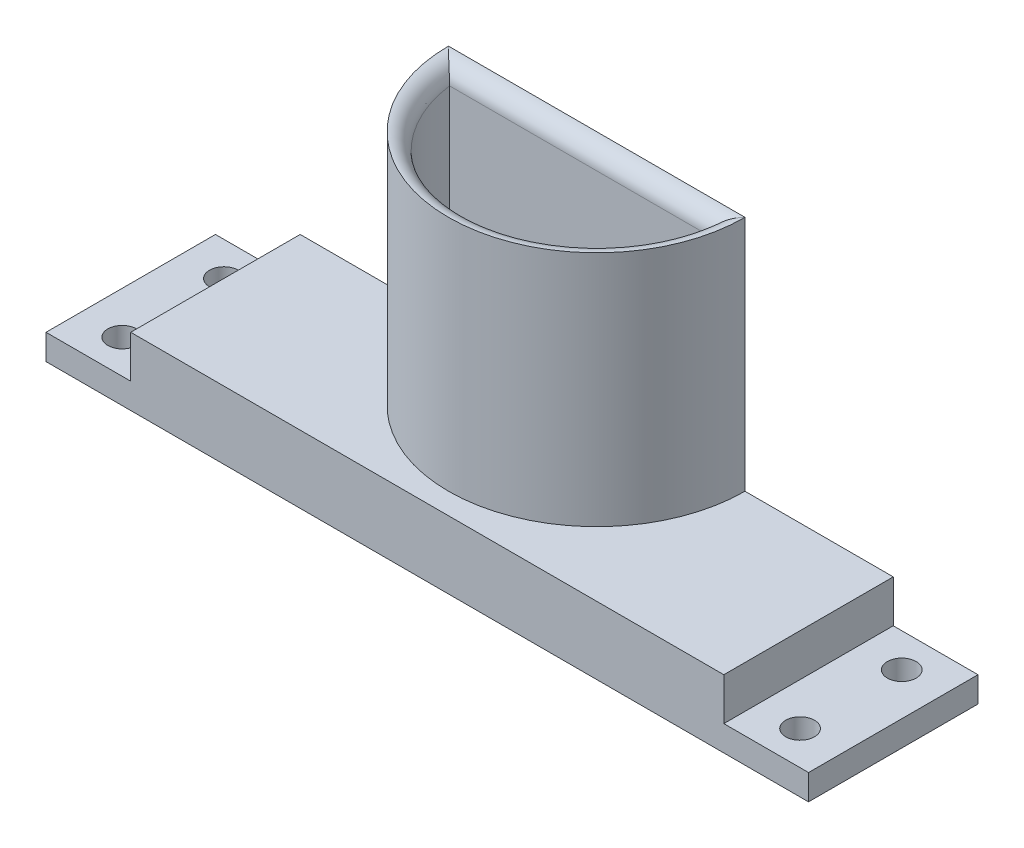
ISO-10303-21;
HEADER;
FILE_DESCRIPTION(('STEP AP214'),'2;1');
FILE_NAME('part.step','',(''),(''),'','','');
FILE_SCHEMA(('AUTOMOTIVE_DESIGN { 1 0 10303 214 1 1 1 1 }'));
ENDSEC;
DATA;
#1=APPLICATION_CONTEXT('core data for automotive mechanical design processes');
#2=APPLICATION_PROTOCOL_DEFINITION('international standard','automotive_design',2000,#1);
#3=PRODUCT_CONTEXT('',#1,'mechanical');
#4=PRODUCT('Part','Part','',(#3));
#5=PRODUCT_RELATED_PRODUCT_CATEGORY('part','',(#4));
#6=PRODUCT_DEFINITION_FORMATION('','',#4);
#7=PRODUCT_DEFINITION_CONTEXT('part definition',#1,'design');
#8=PRODUCT_DEFINITION('design','',#6,#7);
#9=PRODUCT_DEFINITION_SHAPE('','',#8);
#10=(LENGTH_UNIT() NAMED_UNIT(*) SI_UNIT(.MILLI.,.METRE.));
#11=(NAMED_UNIT(*) PLANE_ANGLE_UNIT() SI_UNIT($,.RADIAN.));
#12=(NAMED_UNIT(*) SI_UNIT($,.STERADIAN.) SOLID_ANGLE_UNIT());
#13=UNCERTAINTY_MEASURE_WITH_UNIT(LENGTH_MEASURE(1.E-05),#10,'distance_accuracy_value','');
#14=(GEOMETRIC_REPRESENTATION_CONTEXT(3) GLOBAL_UNCERTAINTY_ASSIGNED_CONTEXT((#13)) GLOBAL_UNIT_ASSIGNED_CONTEXT((#10,
#11,#12)) REPRESENTATION_CONTEXT('',''));
#15=CARTESIAN_POINT('',(0.,0.,0.));
#16=DIRECTION('',(0.,0.,1.));
#17=DIRECTION('',(1.,0.,0.));
#18=AXIS2_PLACEMENT_3D('',#15,#16,#17);
#19=CARTESIAN_POINT('',(35.,5.,10.));
#20=DIRECTION('',(-1.,0.,0.));
#21=DIRECTION('',(0.,0.,1.));
#22=AXIS2_PLACEMENT_3D('',#19,#20,#21);
#23=PLANE('',#22);
#24=DIRECTION('',(0.,0.,-1.));
#25=VECTOR('',#24,1.);
#26=CARTESIAN_POINT('',(35.,0.,10.));
#27=LINE('',#26,#25);
#28=CARTESIAN_POINT('',(35.,0.,10.));
#29=VERTEX_POINT('',#28);
#30=CARTESIAN_POINT('',(35.,0.,-10.));
#31=VERTEX_POINT('',#30);
#32=EDGE_CURVE('E217',#29,#31,#27,.T.);
#33=ORIENTED_EDGE('',*,*,#32,.T.);
#34=DIRECTION('',(0.,-1.,0.));
#35=VECTOR('',#34,1.);
#36=CARTESIAN_POINT('',(35.,5.,-10.));
#37=LINE('',#36,#35);
#38=CARTESIAN_POINT('',(35.,5.,-10.));
#39=VERTEX_POINT('',#38);
#40=EDGE_CURVE('E241',#39,#31,#37,.T.);
#41=ORIENTED_EDGE('',*,*,#40,.F.);
#42=DIRECTION('',(0.,0.,-1.));
#43=VECTOR('',#42,1.);
#44=CARTESIAN_POINT('',(35.,5.,10.));
#45=LINE('',#44,#43);
#46=CARTESIAN_POINT('',(35.,5.,10.));
#47=VERTEX_POINT('',#46);
#48=EDGE_CURVE('E218',#47,#39,#45,.T.);
#49=ORIENTED_EDGE('',*,*,#48,.F.);
#50=DIRECTION('',(0.,-1.,0.));
#51=VECTOR('',#50,1.);
#52=CARTESIAN_POINT('',(35.,5.,10.));
#53=LINE('',#52,#51);
#54=EDGE_CURVE('E228',#47,#29,#53,.T.);
#55=ORIENTED_EDGE('',*,*,#54,.T.);
#56=EDGE_LOOP('',(#33,#41,#49,#55));
#57=FACE_BOUND('',#56,.T.);
#58=ADVANCED_FACE('F43',(#57),#23,.F.);
#59=CARTESIAN_POINT('',(-35.,5.,-10.));
#60=DIRECTION('',(0.,0.,1.));
#61=DIRECTION('',(1.,0.,0.));
#62=AXIS2_PLACEMENT_3D('',#59,#60,#61);
#63=PLANE('',#62);
#64=ORIENTED_EDGE('',*,*,#40,.T.);
#65=DIRECTION('',(1.,0.,0.));
#66=VECTOR('',#65,1.);
#67=CARTESIAN_POINT('',(-45.,0.,-10.));
#68=LINE('',#67,#66);
#69=CARTESIAN_POINT('',(45.,0.,-10.));
#70=VERTEX_POINT('',#69);
#71=EDGE_CURVE('E203',#31,#70,#68,.T.);
#72=ORIENTED_EDGE('',*,*,#71,.T.);
#73=DIRECTION('',(0.,1.,0.));
#74=VECTOR('',#73,1.);
#75=CARTESIAN_POINT('',(45.,-3.,-10.));
#76=LINE('',#75,#74);
#77=CARTESIAN_POINT('',(45.,-3.,-10.));
#78=VERTEX_POINT('',#77);
#79=EDGE_CURVE('E195',#78,#70,#76,.T.);
#80=ORIENTED_EDGE('',*,*,#79,.F.);
#81=DIRECTION('',(1.,0.,0.));
#82=VECTOR('',#81,1.);
#83=CARTESIAN_POINT('',(-45.,-3.,-10.));
#84=LINE('',#83,#82);
#85=CARTESIAN_POINT('',(17.5,-3.,-10.));
#86=VERTEX_POINT('',#85);
#87=EDGE_CURVE('E192',#86,#78,#84,.T.);
#88=ORIENTED_EDGE('',*,*,#87,.F.);
#89=CARTESIAN_POINT('',(-17.5,-3.,-10.));
#90=VERTEX_POINT('',#89);
#91=EDGE_CURVE('E196',#90,#86,#84,.T.);
#92=ORIENTED_EDGE('',*,*,#91,.F.);
#93=CARTESIAN_POINT('',(-45.,-3.,-10.));
#94=VERTEX_POINT('',#93);
#95=EDGE_CURVE('E193',#94,#90,#84,.T.);
#96=ORIENTED_EDGE('',*,*,#95,.F.);
#97=DIRECTION('',(0.,1.,0.));
#98=VECTOR('',#97,1.);
#99=CARTESIAN_POINT('',(-45.,-3.,-10.));
#100=LINE('',#99,#98);
#101=CARTESIAN_POINT('',(-45.,0.,-10.));
#102=VERTEX_POINT('',#101);
#103=EDGE_CURVE('E208',#94,#102,#100,.T.);
#104=ORIENTED_EDGE('',*,*,#103,.T.);
#105=CARTESIAN_POINT('',(-35.,0.,-10.));
#106=VERTEX_POINT('',#105);
#107=EDGE_CURVE('E188',#102,#106,#68,.T.);
#108=ORIENTED_EDGE('',*,*,#107,.T.);
#109=DIRECTION('',(0.,-1.,0.));
#110=VECTOR('',#109,1.);
#111=CARTESIAN_POINT('',(-35.,5.,-10.));
#112=LINE('',#111,#110);
#113=CARTESIAN_POINT('',(-35.,5.,-10.));
#114=VERTEX_POINT('',#113);
#115=EDGE_CURVE('E238',#114,#106,#112,.T.);
#116=ORIENTED_EDGE('',*,*,#115,.F.);
#117=DIRECTION('',(-1.,0.,0.));
#118=VECTOR('',#117,1.);
#119=CARTESIAN_POINT('',(-35.,5.,-10.));
#120=LINE('',#119,#118);
#121=CARTESIAN_POINT('',(-17.5,5.,-10.));
#122=VERTEX_POINT('',#121);
#123=EDGE_CURVE('E175',#122,#114,#120,.T.);
#124=ORIENTED_EDGE('',*,*,#123,.F.);
#125=DIRECTION('',(0.,-1.,0.));
#126=VECTOR('',#125,1.);
#127=CARTESIAN_POINT('',(-17.5,33.,-10.));
#128=LINE('',#127,#126);
#129=CARTESIAN_POINT('',(-17.5,33.,-10.));
#130=VERTEX_POINT('',#129);
#131=EDGE_CURVE('E168',#130,#122,#128,.T.);
#132=ORIENTED_EDGE('',*,*,#131,.F.);
#133=DIRECTION('',(-1.,0.,0.));
#134=VECTOR('',#133,1.);
#135=CARTESIAN_POINT('',(0.,33.,-10.));
#136=LINE('',#135,#134);
#137=CARTESIAN_POINT('',(17.5,33.,-10.));
#138=VERTEX_POINT('',#137);
#139=EDGE_CURVE('E157',#138,#130,#136,.T.);
#140=ORIENTED_EDGE('',*,*,#139,.F.);
#141=DIRECTION('',(0.,-1.,0.));
#142=VECTOR('',#141,1.);
#143=CARTESIAN_POINT('',(17.5,33.,-10.));
#144=LINE('',#143,#142);
#145=CARTESIAN_POINT('',(17.5,5.,-10.));
#146=VERTEX_POINT('',#145);
#147=EDGE_CURVE('E169',#138,#146,#144,.T.);
#148=ORIENTED_EDGE('',*,*,#147,.T.);
#149=EDGE_CURVE('E222',#39,#146,#120,.T.);
#150=ORIENTED_EDGE('',*,*,#149,.F.);
#151=EDGE_LOOP('',(#64,#72,#80,#88,#92,#96,#104,#108,#116,#124,#132,#140,#148,#150));
#152=FACE_BOUND('',#151,.T.);
#153=ADVANCED_FACE('F173',(#152),#63,.F.);
#154=CARTESIAN_POINT('',(-35.,5.,10.));
#155=DIRECTION('',(1.,0.,0.));
#156=DIRECTION('',(0.,0.,-1.));
#157=AXIS2_PLACEMENT_3D('',#154,#155,#156);
#158=PLANE('',#157);
#159=DIRECTION('',(0.,0.,1.));
#160=VECTOR('',#159,1.);
#161=CARTESIAN_POINT('',(-35.,0.,10.));
#162=LINE('',#161,#160);
#163=CARTESIAN_POINT('',(-35.,0.,10.));
#164=VERTEX_POINT('',#163);
#165=EDGE_CURVE('E221',#106,#164,#162,.T.);
#166=ORIENTED_EDGE('',*,*,#165,.T.);
#167=DIRECTION('',(0.,-1.,0.));
#168=VECTOR('',#167,1.);
#169=CARTESIAN_POINT('',(-35.,5.,10.));
#170=LINE('',#169,#168);
#171=CARTESIAN_POINT('',(-35.,5.,10.));
#172=VERTEX_POINT('',#171);
#173=EDGE_CURVE('E235',#172,#164,#170,.T.);
#174=ORIENTED_EDGE('',*,*,#173,.F.);
#175=DIRECTION('',(0.,0.,1.));
#176=VECTOR('',#175,1.);
#177=CARTESIAN_POINT('',(-35.,5.,10.));
#178=LINE('',#177,#176);
#179=EDGE_CURVE('E224',#114,#172,#178,.T.);
#180=ORIENTED_EDGE('',*,*,#179,.F.);
#181=ORIENTED_EDGE('',*,*,#115,.T.);
#182=EDGE_LOOP('',(#166,#174,#180,#181));
#183=FACE_BOUND('',#182,.T.);
#184=ADVANCED_FACE('F345',(#183),#158,.F.);
#185=CARTESIAN_POINT('',(-35.,5.,10.));
#186=DIRECTION('',(0.,0.,-1.));
#187=DIRECTION('',(-1.,0.,0.));
#188=AXIS2_PLACEMENT_3D('',#185,#186,#187);
#189=PLANE('',#188);
#190=ORIENTED_EDGE('',*,*,#173,.T.);
#191=DIRECTION('',(-1.,0.,0.));
#192=VECTOR('',#191,1.);
#193=CARTESIAN_POINT('',(-45.,0.,10.));
#194=LINE('',#193,#192);
#195=CARTESIAN_POINT('',(-45.,0.,10.));
#196=VERTEX_POINT('',#195);
#197=EDGE_CURVE('E179',#164,#196,#194,.T.);
#198=ORIENTED_EDGE('',*,*,#197,.T.);
#199=DIRECTION('',(0.,1.,0.));
#200=VECTOR('',#199,1.);
#201=CARTESIAN_POINT('',(-45.,-3.,10.));
#202=LINE('',#201,#200);
#203=CARTESIAN_POINT('',(-45.,-3.,10.));
#204=VERTEX_POINT('',#203);
#205=EDGE_CURVE('E211',#204,#196,#202,.T.);
#206=ORIENTED_EDGE('',*,*,#205,.F.);
#207=DIRECTION('',(-1.,0.,0.));
#208=VECTOR('',#207,1.);
#209=CARTESIAN_POINT('',(-45.,-3.,10.));
#210=LINE('',#209,#208);
#211=CARTESIAN_POINT('',(45.,-3.,10.));
#212=VERTEX_POINT('',#211);
#213=EDGE_CURVE('E187',#212,#204,#210,.T.);
#214=ORIENTED_EDGE('',*,*,#213,.F.);
#215=DIRECTION('',(0.,1.,0.));
#216=VECTOR('',#215,1.);
#217=CARTESIAN_POINT('',(45.,-3.,10.));
#218=LINE('',#217,#216);
#219=CARTESIAN_POINT('',(45.,0.,10.));
#220=VERTEX_POINT('',#219);
#221=EDGE_CURVE('E214',#212,#220,#218,.T.);
#222=ORIENTED_EDGE('',*,*,#221,.T.);
#223=EDGE_CURVE('E198',#220,#29,#194,.T.);
#224=ORIENTED_EDGE('',*,*,#223,.T.);
#225=ORIENTED_EDGE('',*,*,#54,.F.);
#226=DIRECTION('',(1.,0.,0.));
#227=VECTOR('',#226,1.);
#228=CARTESIAN_POINT('',(-35.,5.,10.));
#229=LINE('',#228,#227);
#230=EDGE_CURVE('E226',#172,#47,#229,.T.);
#231=ORIENTED_EDGE('',*,*,#230,.F.);
#232=EDGE_LOOP('',(#190,#198,#206,#214,#222,#224,#225,#231));
#233=FACE_BOUND('',#232,.T.);
#234=ADVANCED_FACE('F319',(#233),#189,.F.);
#235=CARTESIAN_POINT('',(0.,5.,0.));
#236=DIRECTION('',(0.,-1.,0.));
#237=DIRECTION('',(0.,0.,-1.));
#238=AXIS2_PLACEMENT_3D('',#235,#236,#237);
#239=PLANE('',#238);
#240=CARTESIAN_POINT('',(0.,5.,-10.));
#241=DIRECTION('',(0.,1.,0.));
#242=DIRECTION('',(0.,0.,1.));
#243=AXIS2_PLACEMENT_3D('',#240,#241,#242);
#244=CIRCLE('',#243,17.5);
#245=EDGE_CURVE('E162',#122,#146,#244,.T.);
#246=ORIENTED_EDGE('',*,*,#245,.F.);
#247=ORIENTED_EDGE('',*,*,#123,.T.);
#248=ORIENTED_EDGE('',*,*,#179,.T.);
#249=ORIENTED_EDGE('',*,*,#230,.T.);
#250=ORIENTED_EDGE('',*,*,#48,.T.);
#251=ORIENTED_EDGE('',*,*,#149,.T.);
#252=EDGE_LOOP('',(#246,#247,#248,#249,#250,#251));
#253=FACE_BOUND('',#252,.T.);
#254=ADVANCED_FACE('F311',(#253),#239,.F.);
#255=CARTESIAN_POINT('',(0.,0.,0.));
#256=DIRECTION('',(0.,1.,0.));
#257=DIRECTION('',(0.,0.,1.));
#258=AXIS2_PLACEMENT_3D('',#255,#256,#257);
#259=PLANE('',#258);
#260=CARTESIAN_POINT('',(40.,0.,-6.));
#261=DIRECTION('',(0.,1.,0.));
#262=DIRECTION('',(0.,0.,1.));
#263=AXIS2_PLACEMENT_3D('',#260,#261,#262);
#264=CIRCLE('',#263,1.69999999999999);
#265=CARTESIAN_POINT('',(40.,0.,-4.3));
#266=VERTEX_POINT('',#265);
#267=EDGE_CURVE('E287',#266,#266,#264,.T.);
#268=ORIENTED_EDGE('',*,*,#267,.F.);
#269=EDGE_LOOP('',(#268));
#270=FACE_BOUND('',#269,.T.);
#271=CARTESIAN_POINT('',(40.,0.,6.));
#272=DIRECTION('',(0.,1.,0.));
#273=DIRECTION('',(0.,0.,1.));
#274=AXIS2_PLACEMENT_3D('',#271,#272,#273);
#275=CIRCLE('',#274,1.69999999999999);
#276=CARTESIAN_POINT('',(40.,0.,7.69999999999999));
#277=VERTEX_POINT('',#276);
#278=EDGE_CURVE('E284',#277,#277,#275,.T.);
#279=ORIENTED_EDGE('',*,*,#278,.F.);
#280=EDGE_LOOP('',(#279));
#281=FACE_BOUND('',#280,.T.);
#282=ORIENTED_EDGE('',*,*,#32,.F.);
#283=ORIENTED_EDGE('',*,*,#223,.F.);
#284=DIRECTION('',(0.,0.,1.));
#285=VECTOR('',#284,1.);
#286=CARTESIAN_POINT('',(45.,0.,-10.));
#287=LINE('',#286,#285);
#288=EDGE_CURVE('E176',#70,#220,#287,.T.);
#289=ORIENTED_EDGE('',*,*,#288,.F.);
#290=ORIENTED_EDGE('',*,*,#71,.F.);
#291=EDGE_LOOP('',(#282,#283,#289,#290));
#292=FACE_BOUND('',#291,.T.);
#293=ADVANCED_FACE('F316',(#270,#281,#292),#259,.T.);
#294=CARTESIAN_POINT('',(-40.,0.,-6.));
#295=DIRECTION('',(0.,1.,0.));
#296=DIRECTION('',(0.,0.,1.));
#297=AXIS2_PLACEMENT_3D('',#294,#295,#296);
#298=CIRCLE('',#297,1.69999999999999);
#299=CARTESIAN_POINT('',(-40.,0.,-4.30000000000001));
#300=VERTEX_POINT('',#299);
#301=EDGE_CURVE('E299',#300,#300,#298,.T.);
#302=ORIENTED_EDGE('',*,*,#301,.F.);
#303=EDGE_LOOP('',(#302));
#304=FACE_BOUND('',#303,.T.);
#305=CARTESIAN_POINT('',(-40.,0.,6.));
#306=DIRECTION('',(0.,1.,0.));
#307=DIRECTION('',(0.,0.,1.));
#308=AXIS2_PLACEMENT_3D('',#305,#306,#307);
#309=CIRCLE('',#308,1.69999999999999);
#310=CARTESIAN_POINT('',(-40.,0.,7.69999999999999));
#311=VERTEX_POINT('',#310);
#312=EDGE_CURVE('E288',#311,#311,#309,.T.);
#313=ORIENTED_EDGE('',*,*,#312,.F.);
#314=EDGE_LOOP('',(#313));
#315=FACE_BOUND('',#314,.T.);
#316=ORIENTED_EDGE('',*,*,#165,.F.);
#317=ORIENTED_EDGE('',*,*,#107,.F.);
#318=DIRECTION('',(0.,0.,-1.));
#319=VECTOR('',#318,1.);
#320=CARTESIAN_POINT('',(-45.,0.,-10.));
#321=LINE('',#320,#319);
#322=EDGE_CURVE('E201',#196,#102,#321,.T.);
#323=ORIENTED_EDGE('',*,*,#322,.F.);
#324=ORIENTED_EDGE('',*,*,#197,.F.);
#325=EDGE_LOOP('',(#316,#317,#323,#324));
#326=FACE_BOUND('',#325,.T.);
#327=ADVANCED_FACE('F342',(#304,#315,#326),#259,.T.);
#328=CARTESIAN_POINT('',(45.,-3.,-10.));
#329=DIRECTION('',(-1.,0.,0.));
#330=DIRECTION('',(0.,0.,1.));
#331=AXIS2_PLACEMENT_3D('',#328,#329,#330);
#332=PLANE('',#331);
#333=ORIENTED_EDGE('',*,*,#288,.T.);
#334=ORIENTED_EDGE('',*,*,#221,.F.);
#335=DIRECTION('',(0.,0.,1.));
#336=VECTOR('',#335,1.);
#337=CARTESIAN_POINT('',(45.,-3.,-10.));
#338=LINE('',#337,#336);
#339=EDGE_CURVE('E184',#78,#212,#338,.T.);
#340=ORIENTED_EDGE('',*,*,#339,.F.);
#341=ORIENTED_EDGE('',*,*,#79,.T.);
#342=EDGE_LOOP('',(#333,#334,#340,#341));
#343=FACE_BOUND('',#342,.T.);
#344=ADVANCED_FACE('F324',(#343),#332,.F.);
#345=CARTESIAN_POINT('',(-45.,-3.,-10.));
#346=DIRECTION('',(1.,0.,0.));
#347=DIRECTION('',(0.,0.,-1.));
#348=AXIS2_PLACEMENT_3D('',#345,#346,#347);
#349=PLANE('',#348);
#350=ORIENTED_EDGE('',*,*,#322,.T.);
#351=ORIENTED_EDGE('',*,*,#103,.F.);
#352=DIRECTION('',(0.,0.,-1.));
#353=VECTOR('',#352,1.);
#354=CARTESIAN_POINT('',(-45.,-3.,-10.));
#355=LINE('',#354,#353);
#356=EDGE_CURVE('E190',#204,#94,#355,.T.);
#357=ORIENTED_EDGE('',*,*,#356,.F.);
#358=ORIENTED_EDGE('',*,*,#205,.T.);
#359=EDGE_LOOP('',(#350,#351,#357,#358));
#360=FACE_BOUND('',#359,.T.);
#361=ADVANCED_FACE('F347',(#360),#349,.F.);
#362=CARTESIAN_POINT('',(0.,-3.,0.));
#363=DIRECTION('',(0.,1.,0.));
#364=DIRECTION('',(0.,0.,1.));
#365=AXIS2_PLACEMENT_3D('',#362,#363,#364);
#366=PLANE('',#365);
#367=CARTESIAN_POINT('',(-40.,-3.,-6.));
#368=DIRECTION('',(0.,1.,0.));
#369=DIRECTION('',(0.,0.,1.));
#370=AXIS2_PLACEMENT_3D('',#367,#368,#369);
#371=CIRCLE('',#370,1.69999999999999);
#372=CARTESIAN_POINT('',(-40.,-3.,-4.30000000000001));
#373=VERTEX_POINT('',#372);
#374=EDGE_CURVE('E48',#373,#373,#371,.T.);
#375=ORIENTED_EDGE('',*,*,#374,.T.);
#376=EDGE_LOOP('',(#375));
#377=FACE_BOUND('',#376,.T.);
#378=CARTESIAN_POINT('',(-40.,-3.,6.));
#379=DIRECTION('',(0.,1.,0.));
#380=DIRECTION('',(0.,0.,1.));
#381=AXIS2_PLACEMENT_3D('',#378,#379,#380);
#382=CIRCLE('',#381,1.69999999999999);
#383=CARTESIAN_POINT('',(-40.,-3.,7.69999999999999));
#384=VERTEX_POINT('',#383);
#385=EDGE_CURVE('E285',#384,#384,#382,.T.);
#386=ORIENTED_EDGE('',*,*,#385,.T.);
#387=EDGE_LOOP('',(#386));
#388=FACE_BOUND('',#387,.T.);
#389=CARTESIAN_POINT('',(40.,-3.,-6.));
#390=DIRECTION('',(0.,1.,0.));
#391=DIRECTION('',(0.,0.,1.));
#392=AXIS2_PLACEMENT_3D('',#389,#390,#391);
#393=CIRCLE('',#392,1.69999999999999);
#394=CARTESIAN_POINT('',(40.,-3.,-4.30000000000001));
#395=VERTEX_POINT('',#394);
#396=EDGE_CURVE('E292',#395,#395,#393,.T.);
#397=ORIENTED_EDGE('',*,*,#396,.T.);
#398=EDGE_LOOP('',(#397));
#399=FACE_BOUND('',#398,.T.);
#400=CARTESIAN_POINT('',(40.,-3.,6.));
#401=DIRECTION('',(0.,1.,0.));
#402=DIRECTION('',(0.,0.,1.));
#403=AXIS2_PLACEMENT_3D('',#400,#401,#402);
#404=CIRCLE('',#403,1.69999999999999);
#405=CARTESIAN_POINT('',(40.,-3.,7.69999999999999));
#406=VERTEX_POINT('',#405);
#407=EDGE_CURVE('E282',#406,#406,#404,.T.);
#408=ORIENTED_EDGE('',*,*,#407,.T.);
#409=EDGE_LOOP('',(#408));
#410=FACE_BOUND('',#409,.T.);
#411=ORIENTED_EDGE('',*,*,#95,.T.);
#412=CARTESIAN_POINT('',(0.,-3.,-10.));
#413=DIRECTION('',(0.,1.,0.));
#414=DIRECTION('',(0.,0.,1.));
#415=AXIS2_PLACEMENT_3D('',#412,#413,#414);
#416=CIRCLE('',#415,17.5);
#417=EDGE_CURVE('E247',#90,#86,#416,.T.);
#418=ORIENTED_EDGE('',*,*,#417,.T.);
#419=ORIENTED_EDGE('',*,*,#87,.T.);
#420=ORIENTED_EDGE('',*,*,#339,.T.);
#421=ORIENTED_EDGE('',*,*,#213,.T.);
#422=ORIENTED_EDGE('',*,*,#356,.T.);
#423=EDGE_LOOP('',(#411,#418,#419,#420,#421,#422));
#424=FACE_BOUND('',#423,.T.);
#425=ADVANCED_FACE('F335',(#377,#388,#399,#410,#424),#366,.F.);
#426=CARTESIAN_POINT('',(0.,33.,-10.));
#427=DIRECTION('',(0.,-1.,0.));
#428=DIRECTION('',(0.,0.,-1.));
#429=AXIS2_PLACEMENT_3D('',#426,#427,#428);
#430=CYLINDRICAL_SURFACE('',#429,17.5);
#431=ORIENTED_EDGE('',*,*,#245,.T.);
#432=ORIENTED_EDGE('',*,*,#147,.F.);
#433=CARTESIAN_POINT('',(0.,33.,-10.));
#434=DIRECTION('',(0.,1.,0.));
#435=DIRECTION('',(0.,0.,1.));
#436=AXIS2_PLACEMENT_3D('',#433,#434,#435);
#437=CIRCLE('',#436,17.5);
#438=EDGE_CURVE('E147',#130,#138,#437,.T.);
#439=ORIENTED_EDGE('',*,*,#438,.F.);
#440=ORIENTED_EDGE('',*,*,#131,.T.);
#441=EDGE_LOOP('',(#431,#432,#439,#440));
#442=FACE_BOUND('',#441,.T.);
#443=ADVANCED_FACE('F167',(#442),#430,.T.);
#444=CARTESIAN_POINT('',(0.,-3.,-10.));
#445=DIRECTION('',(0.,1.,0.));
#446=DIRECTION('',(0.,0.,1.));
#447=AXIS2_PLACEMENT_3D('',#444,#445,#446);
#448=CYLINDRICAL_SURFACE('',#447,15.5);
#449=DIRECTION('',(0.,1.,0.));
#450=VECTOR('',#449,1.);
#451=CARTESIAN_POINT('',(15.3704261489394,-3.,-8.));
#452=LINE('',#451,#450);
#453=CARTESIAN_POINT('',(15.3704261489394,-1.,-8.));
#454=VERTEX_POINT('',#453);
#455=CARTESIAN_POINT('',(15.3704261489394,31.,-8.));
#456=VERTEX_POINT('',#455);
#457=EDGE_CURVE('E153',#454,#456,#452,.T.);
#458=ORIENTED_EDGE('',*,*,#457,.F.);
#459=CARTESIAN_POINT('',(0.,-1.,-10.));
#460=DIRECTION('',(0.,1.,0.));
#461=DIRECTION('',(0.,0.,1.));
#462=AXIS2_PLACEMENT_3D('',#459,#460,#461);
#463=CIRCLE('',#462,15.5);
#464=CARTESIAN_POINT('',(-15.3704261489394,-1.,-8.));
#465=VERTEX_POINT('',#464);
#466=EDGE_CURVE('E11',#454,#465,#463,.F.);
#467=ORIENTED_EDGE('',*,*,#466,.T.);
#468=DIRECTION('',(0.,1.,0.));
#469=VECTOR('',#468,1.);
#470=CARTESIAN_POINT('',(-15.3704261489394,-3.,-8.));
#471=LINE('',#470,#469);
#472=CARTESIAN_POINT('',(-15.3704261489394,31.,-8.));
#473=VERTEX_POINT('',#472);
#474=EDGE_CURVE('E306',#465,#473,#471,.T.);
#475=ORIENTED_EDGE('',*,*,#474,.T.);
#476=CARTESIAN_POINT('',(0.,31.,-10.));
#477=DIRECTION('',(0.,1.,0.));
#478=DIRECTION('',(0.,0.,1.));
#479=AXIS2_PLACEMENT_3D('',#476,#477,#478);
#480=CIRCLE('',#479,15.5);
#481=EDGE_CURVE('E150',#473,#456,#480,.T.);
#482=ORIENTED_EDGE('',*,*,#481,.T.);
#483=EDGE_LOOP('',(#458,#467,#475,#482));
#484=FACE_BOUND('',#483,.T.);
#485=ADVANCED_FACE('F382',(#484),#448,.F.);
#486=CARTESIAN_POINT('',(15.3704261489394,-3.,-8.));
#487=DIRECTION('',(0.,0.,-1.));
#488=DIRECTION('',(-1.,0.,0.));
#489=AXIS2_PLACEMENT_3D('',#486,#487,#488);
#490=PLANE('',#489);
#491=ORIENTED_EDGE('',*,*,#474,.F.);
#492=DIRECTION('',(-1.,0.,0.));
#493=VECTOR('',#492,1.);
#494=CARTESIAN_POINT('',(15.3704261489394,-1.,-8.));
#495=LINE('',#494,#493);
#496=EDGE_CURVE('E53',#465,#454,#495,.F.);
#497=ORIENTED_EDGE('',*,*,#496,.T.);
#498=ORIENTED_EDGE('',*,*,#457,.T.);
#499=DIRECTION('',(-1.,0.,0.));
#500=VECTOR('',#499,1.);
#501=CARTESIAN_POINT('',(-15.3704261489394,31.,-8.));
#502=LINE('',#501,#500);
#503=EDGE_CURVE('E244',#456,#473,#502,.T.);
#504=ORIENTED_EDGE('',*,*,#503,.T.);
#505=EDGE_LOOP('',(#491,#497,#498,#504));
#506=FACE_BOUND('',#505,.T.);
#507=ADVANCED_FACE('F263',(#506),#490,.F.);
#508=CARTESIAN_POINT('',(15.3704261489394,31.,-10.));
#509=DIRECTION('',(1.,0.,0.));
#510=DIRECTION('',(0.,0.,-1.));
#511=AXIS2_PLACEMENT_3D('',#508,#509,#510);
#512=CYLINDRICAL_SURFACE('',#511,2.);
#513=CARTESIAN_POINT('',(15.3704261489394,31.,-8.));
#514=CARTESIAN_POINT('',(15.3704113490324,31.0434603124713,-7.99998789623637));
#515=CARTESIAN_POINT('',(15.3720384867977,31.0869097163397,-8.00141614860178));
#516=CARTESIAN_POINT('',(15.3784623074006,31.1733474667974,-8.00705955264037));
#517=CARTESIAN_POINT('',(15.3832557060606,31.2163362442655,-8.01127181662339));
#518=CARTESIAN_POINT('',(15.3958332317555,31.3010678103459,-8.0223326945883));
#519=CARTESIAN_POINT('',(15.4035861385886,31.3428188610949,-8.02915378911016));
#520=CARTESIAN_POINT('',(15.4218873065089,31.4252097834838,-8.04527211246546));
#521=CARTESIAN_POINT('',(15.4324361262038,31.4658494312796,-8.05456983611728));
#522=CARTESIAN_POINT('',(15.4678452451839,31.5853710437738,-8.08581947718849));
#523=CARTESIAN_POINT('',(15.496533325425,31.6622711603222,-8.11118487201765));
#524=CARTESIAN_POINT('',(15.5621676042231,31.8095168129804,-8.16942803416061));
#525=CARTESIAN_POINT('',(15.5991370150493,31.8798431219544,-8.20232692346899));
#526=CARTESIAN_POINT('',(15.6990783145784,32.0460657957153,-8.29164333111114));
#527=CARTESIAN_POINT('',(15.7659303858716,32.137671288152,-8.35169901986379));
#528=CARTESIAN_POINT('',(15.9090438640022,32.3055985847829,-8.48121517508006));
#529=CARTESIAN_POINT('',(15.9853250889464,32.3818872824975,-8.55069548098992));
#530=CARTESIAN_POINT('',(16.1218211511116,32.5007425086086,-8.67599534594904));
#531=CARTESIAN_POINT('',(16.1805623666144,32.5467729873894,-8.7302004625344));
#532=CARTESIAN_POINT('',(16.3004423371165,32.6317687906735,-8.84145191677523));
#533=CARTESIAN_POINT('',(16.3615821779766,32.6707308693488,-8.89849954447002));
#534=CARTESIAN_POINT('',(16.5476428293294,32.7775070718227,-9.07311939366307));
#535=CARTESIAN_POINT('',(16.6752124326251,32.8352175913138,-9.19417559964872));
#536=CARTESIAN_POINT('',(16.9181145433245,32.9198098930191,-9.42741593743311));
#537=CARTESIAN_POINT('',(17.0331179892186,32.9495227784052,-9.53896495980482));
#538=CARTESIAN_POINT('',(17.2635313505971,32.9894097494525,-9.76475155047689));
#539=CARTESIAN_POINT('',(17.3789397753517,32.9996275202113,-9.87898252567176));
#540=CARTESIAN_POINT('',(17.495783478261,32.9999966634796,-9.99578385666528));
#541=CARTESIAN_POINT('',(17.4978918559567,32.9999999965333,-9.99789185333453));
#542=CARTESIAN_POINT('',(17.5,33.,-10.));
#543=B_SPLINE_CURVE_WITH_KNOTS('',3,(#513,#514,#515,#516,#517,#518,#519,#520,#521,#522,#523,
#524,#525,#526,#527,#528,#529,#530,#531,#532,#533,#534,#535,#536,#537,#538,#539,#540,#541,#542),
.UNSPECIFIED.,.F.,.F.,(4,2,2,2,2,2,2,2,2,2,2,2,2,2,4),(0.,0.130309398659017,0.260483846779937,
0.389321409732268,0.518184733132639,0.774655769336656,1.03185488546772,1.41469409605983,
1.7983520909447,2.07470453961497,2.35118357061114,2.90410540558524,3.39188285813809,
3.87856599820887,3.88751027574357),.UNSPECIFIED.);
#544=EDGE_CURVE('E154',#138,#456,#543,.F.);
#545=ORIENTED_EDGE('',*,*,#544,.F.);
#546=ORIENTED_EDGE('',*,*,#139,.T.);
#547=CARTESIAN_POINT('',(-15.3704261489394,31.,-8.));
#548=CARTESIAN_POINT('',(-15.3704113490324,31.0434603124713,-7.99998789623637));
#549=CARTESIAN_POINT('',(-15.3720384867977,31.0869097163397,-8.00141614860178));
#550=CARTESIAN_POINT('',(-15.3784623074006,31.1733474667974,-8.00705955264037));
#551=CARTESIAN_POINT('',(-15.3832557060606,31.2163362442655,-8.01127181662339));
#552=CARTESIAN_POINT('',(-15.3958332317555,31.3010678103459,-8.0223326945883));
#553=CARTESIAN_POINT('',(-15.4035861385886,31.3428188610949,-8.02915378911016));
#554=CARTESIAN_POINT('',(-15.4218873065089,31.4252097834838,-8.04527211246546));
#555=CARTESIAN_POINT('',(-15.4324361262038,31.4658494312796,-8.05456983611728));
#556=CARTESIAN_POINT('',(-15.4678452451839,31.5853710437738,-8.08581947718849));
#557=CARTESIAN_POINT('',(-15.496533325425,31.6622711603222,-8.11118487201765));
#558=CARTESIAN_POINT('',(-15.5621676042231,31.8095168129804,-8.16942803416061));
#559=CARTESIAN_POINT('',(-15.5991370150493,31.8798431219544,-8.20232692346899));
#560=CARTESIAN_POINT('',(-15.6990783145784,32.0460657957153,-8.29164333111114));
#561=CARTESIAN_POINT('',(-15.7659303858716,32.137671288152,-8.35169901986379));
#562=CARTESIAN_POINT('',(-15.9090438640022,32.3055985847829,-8.48121517508006));
#563=CARTESIAN_POINT('',(-15.9853250889464,32.3818872824975,-8.55069548098992));
#564=CARTESIAN_POINT('',(-16.1218211511116,32.5007425086086,-8.67599534594904));
#565=CARTESIAN_POINT('',(-16.1805623666144,32.5467729873894,-8.7302004625344));
#566=CARTESIAN_POINT('',(-16.3004423371165,32.6317687906735,-8.84145191677523));
#567=CARTESIAN_POINT('',(-16.3615821779766,32.6707308693488,-8.89849954447002));
#568=CARTESIAN_POINT('',(-16.5476428293294,32.7775070718227,-9.07311939366307));
#569=CARTESIAN_POINT('',(-16.6752124326251,32.8352175913138,-9.19417559964872));
#570=CARTESIAN_POINT('',(-16.9181145433245,32.9198098930191,-9.42741593743311));
#571=CARTESIAN_POINT('',(-17.0331179892186,32.9495227784052,-9.53896495980482));
#572=CARTESIAN_POINT('',(-17.2635313505971,32.9894097494525,-9.76475155047689));
#573=CARTESIAN_POINT('',(-17.3789397753517,32.9996275202113,-9.87898252567176));
#574=CARTESIAN_POINT('',(-17.495783478261,32.9999966634796,-9.99578385666528));
#575=CARTESIAN_POINT('',(-17.4978918559567,32.9999999965333,-9.99789185333453));
#576=CARTESIAN_POINT('',(-17.5,33.,-10.));
#577=B_SPLINE_CURVE_WITH_KNOTS('',3,(#547,#548,#549,#550,#551,#552,#553,#554,#555,#556,#557,
#558,#559,#560,#561,#562,#563,#564,#565,#566,#567,#568,#569,#570,#571,#572,#573,#574,#575,#576),
.UNSPECIFIED.,.F.,.F.,(4,2,2,2,2,2,2,2,2,2,2,2,2,2,4),(0.,0.130309398659017,0.260483846779937,
0.389321409732268,0.518184733132639,0.774655769336656,1.03185488546772,1.41469409605983,
1.7983520909447,2.07470453961497,2.35118357061114,2.90410540558524,3.39188285813809,
3.87856599820887,3.88751027574357),.UNSPECIFIED.);
#578=EDGE_CURVE('E142',#473,#130,#577,.T.);
#579=ORIENTED_EDGE('',*,*,#578,.F.);
#580=ORIENTED_EDGE('',*,*,#503,.F.);
#581=EDGE_LOOP('',(#545,#546,#579,#580));
#582=FACE_BOUND('',#581,.T.);
#583=ADVANCED_FACE('F158',(#582),#512,.T.);
#584=CARTESIAN_POINT('',(0.,31.,-10.));
#585=DIRECTION('',(0.,1.,0.));
#586=DIRECTION('',(0.,0.,1.));
#587=AXIS2_PLACEMENT_3D('',#584,#585,#586);
#588=TOROIDAL_SURFACE('',#587,17.5,2.);
#589=ORIENTED_EDGE('',*,*,#578,.T.);
#590=ORIENTED_EDGE('',*,*,#438,.T.);
#591=ORIENTED_EDGE('',*,*,#544,.T.);
#592=ORIENTED_EDGE('',*,*,#481,.F.);
#593=EDGE_LOOP('',(#589,#590,#591,#592));
#594=FACE_BOUND('',#593,.T.);
#595=ADVANCED_FACE('F144',(#594),#588,.T.);
#596=CARTESIAN_POINT('',(0.,-1.,-10.));
#597=DIRECTION('',(0.,1.,0.));
#598=DIRECTION('',(0.,0.,1.));
#599=AXIS2_PLACEMENT_3D('',#596,#597,#598);
#600=TOROIDAL_SURFACE('',#599,17.5,2.);
#601=CARTESIAN_POINT('',(-15.3704261489394,-1.,-8.));
#602=CARTESIAN_POINT('',(-15.3704113490324,-1.04346031247127,-7.99998789623637));
#603=CARTESIAN_POINT('',(-15.3720384867977,-1.0869097163397,-8.00141614860178));
#604=CARTESIAN_POINT('',(-15.3784623074006,-1.17334746679736,-8.00705955264037));
#605=CARTESIAN_POINT('',(-15.3832557060606,-1.21633624426547,-8.01127181662339));
#606=CARTESIAN_POINT('',(-15.3958332317555,-1.30106781034593,-8.0223326945883));
#607=CARTESIAN_POINT('',(-15.4035861385886,-1.34281886109492,-8.02915378911016));
#608=CARTESIAN_POINT('',(-15.4218873065089,-1.42520978348377,-8.04527211246546));
#609=CARTESIAN_POINT('',(-15.4324361262038,-1.46584943127963,-8.05456983611728));
#610=CARTESIAN_POINT('',(-15.4678452451839,-1.58537104377379,-8.08581947718849));
#611=CARTESIAN_POINT('',(-15.496533325425,-1.66227116032219,-8.11118487201765));
#612=CARTESIAN_POINT('',(-15.5621676042231,-1.80951681298037,-8.16942803416061));
#613=CARTESIAN_POINT('',(-15.5991370150493,-1.87984312195444,-8.20232692346899));
#614=CARTESIAN_POINT('',(-15.6990783145784,-2.04606579571527,-8.29164333111114));
#615=CARTESIAN_POINT('',(-15.7659303858716,-2.13767128815196,-8.35169901986379));
#616=CARTESIAN_POINT('',(-15.9090438640022,-2.30559858478294,-8.48121517508007));
#617=CARTESIAN_POINT('',(-15.9853250889464,-2.38188728249755,-8.55069548098992));
#618=CARTESIAN_POINT('',(-16.1218211511116,-2.50074250860862,-8.67599534594904));
#619=CARTESIAN_POINT('',(-16.1805623666144,-2.54677298738937,-8.73020046253439));
#620=CARTESIAN_POINT('',(-16.3004423371165,-2.63176879067351,-8.84145191677522));
#621=CARTESIAN_POINT('',(-16.3615821779766,-2.67073086934884,-8.89849954447002));
#622=CARTESIAN_POINT('',(-16.5476428293294,-2.77750707182268,-9.07311939366307));
#623=CARTESIAN_POINT('',(-16.6752124326252,-2.83521759131378,-9.19417559964869));
#624=CARTESIAN_POINT('',(-16.9181145433245,-2.9198098930191,-9.42741593743313));
#625=CARTESIAN_POINT('',(-17.0331179892185,-2.94952277840521,-9.5389649598049));
#626=CARTESIAN_POINT('',(-17.2635313505972,-2.98940974945247,-9.76475155047682));
#627=CARTESIAN_POINT('',(-17.378939775352,-2.99962752021137,-9.87898252567148));
#628=CARTESIAN_POINT('',(-17.495783478261,-2.99999666347959,-9.99578385666527));
#629=CARTESIAN_POINT('',(-17.4978918559567,-2.99999999653327,-9.99789185333453));
#630=CARTESIAN_POINT('',(-17.5,-3.,-10.));
#631=B_SPLINE_CURVE_WITH_KNOTS('',3,(#601,#602,#603,#604,#605,#606,#607,#608,#609,#610,#611,
#612,#613,#614,#615,#616,#617,#618,#619,#620,#621,#622,#623,#624,#625,#626,#627,#628,#629,#630),
.UNSPECIFIED.,.F.,.F.,(4,2,2,2,2,2,2,2,2,2,2,2,2,2,4),(0.,0.130309398659014,0.260483846779928,
0.389321409732269,0.518184733132643,0.77465576933666,1.03185488546773,1.41469409605983,
1.7983520909447,2.07470453961497,2.35118357061113,2.90410540558525,3.39188285813811,
3.87856599820888,3.88751027574357),.UNSPECIFIED.);
#632=EDGE_CURVE('E271',#465,#90,#631,.T.);
#633=ORIENTED_EDGE('',*,*,#632,.F.);
#634=ORIENTED_EDGE('',*,*,#466,.F.);
#635=CARTESIAN_POINT('',(15.3704261489394,-1.,-8.));
#636=CARTESIAN_POINT('',(15.3704113490324,-1.04346031247127,-7.99998789623637));
#637=CARTESIAN_POINT('',(15.3720384867977,-1.0869097163397,-8.00141614860178));
#638=CARTESIAN_POINT('',(15.3784623074006,-1.17334746679736,-8.00705955264037));
#639=CARTESIAN_POINT('',(15.3832557060606,-1.21633624426547,-8.01127181662339));
#640=CARTESIAN_POINT('',(15.3958332317555,-1.30106781034593,-8.0223326945883));
#641=CARTESIAN_POINT('',(15.4035861385886,-1.34281886109492,-8.02915378911016));
#642=CARTESIAN_POINT('',(15.4218873065089,-1.42520978348377,-8.04527211246546));
#643=CARTESIAN_POINT('',(15.4324361262038,-1.46584943127963,-8.05456983611728));
#644=CARTESIAN_POINT('',(15.4678452451839,-1.58537104377379,-8.08581947718849));
#645=CARTESIAN_POINT('',(15.496533325425,-1.66227116032219,-8.11118487201765));
#646=CARTESIAN_POINT('',(15.5621676042231,-1.80951681298037,-8.16942803416061));
#647=CARTESIAN_POINT('',(15.5991370150493,-1.87984312195444,-8.20232692346899));
#648=CARTESIAN_POINT('',(15.6990783145784,-2.04606579571527,-8.29164333111114));
#649=CARTESIAN_POINT('',(15.7659303858716,-2.13767128815196,-8.35169901986379));
#650=CARTESIAN_POINT('',(15.9090438640022,-2.30559858478294,-8.48121517508007));
#651=CARTESIAN_POINT('',(15.9853250889464,-2.38188728249755,-8.55069548098992));
#652=CARTESIAN_POINT('',(16.1218211511116,-2.50074250860862,-8.67599534594904));
#653=CARTESIAN_POINT('',(16.1805623666144,-2.54677298738937,-8.73020046253439));
#654=CARTESIAN_POINT('',(16.3004423371165,-2.63176879067351,-8.84145191677522));
#655=CARTESIAN_POINT('',(16.3615821779766,-2.67073086934884,-8.89849954447002));
#656=CARTESIAN_POINT('',(16.5476428293294,-2.77750707182268,-9.07311939366307));
#657=CARTESIAN_POINT('',(16.6752124326252,-2.83521759131378,-9.19417559964869));
#658=CARTESIAN_POINT('',(16.9181145433245,-2.9198098930191,-9.42741593743313));
#659=CARTESIAN_POINT('',(17.0331179892185,-2.94952277840521,-9.5389649598049));
#660=CARTESIAN_POINT('',(17.2635313505972,-2.98940974945247,-9.76475155047682));
#661=CARTESIAN_POINT('',(17.378939775352,-2.99962752021137,-9.87898252567148));
#662=CARTESIAN_POINT('',(17.495783478261,-2.99999666347959,-9.99578385666527));
#663=CARTESIAN_POINT('',(17.4978918559567,-2.99999999653327,-9.99789185333453));
#664=CARTESIAN_POINT('',(17.5,-3.,-10.));
#665=B_SPLINE_CURVE_WITH_KNOTS('',3,(#635,#636,#637,#638,#639,#640,#641,#642,#643,#644,#645,
#646,#647,#648,#649,#650,#651,#652,#653,#654,#655,#656,#657,#658,#659,#660,#661,#662,#663,#664),
.UNSPECIFIED.,.F.,.F.,(4,2,2,2,2,2,2,2,2,2,2,2,2,2,4),(0.,0.130309398659014,0.260483846779928,
0.389321409732269,0.518184733132643,0.77465576933666,1.03185488546773,1.41469409605983,
1.7983520909447,2.07470453961497,2.35118357061113,2.90410540558525,3.39188285813811,
3.87856599820888,3.88751027574357),.UNSPECIFIED.);
#666=EDGE_CURVE('E67',#86,#454,#665,.F.);
#667=ORIENTED_EDGE('',*,*,#666,.F.);
#668=ORIENTED_EDGE('',*,*,#417,.F.);
#669=EDGE_LOOP('',(#633,#634,#667,#668));
#670=FACE_BOUND('',#669,.T.);
#671=ADVANCED_FACE('F264',(#670),#600,.T.);
#672=CARTESIAN_POINT('',(0.,-1.,-10.));
#673=DIRECTION('',(-1.,0.,0.));
#674=DIRECTION('',(0.,0.,1.));
#675=AXIS2_PLACEMENT_3D('',#672,#673,#674);
#676=CYLINDRICAL_SURFACE('',#675,2.);
#677=ORIENTED_EDGE('',*,*,#666,.T.);
#678=ORIENTED_EDGE('',*,*,#496,.F.);
#679=ORIENTED_EDGE('',*,*,#632,.T.);
#680=ORIENTED_EDGE('',*,*,#91,.T.);
#681=EDGE_LOOP('',(#677,#678,#679,#680));
#682=FACE_BOUND('',#681,.T.);
#683=ADVANCED_FACE('F45',(#682),#676,.T.);
#684=CARTESIAN_POINT('',(40.,0.,6.));
#685=DIRECTION('',(0.,1.,0.));
#686=DIRECTION('',(0.,0.,1.));
#687=AXIS2_PLACEMENT_3D('',#684,#685,#686);
#688=CYLINDRICAL_SURFACE('',#687,1.69999999999999);
#689=ORIENTED_EDGE('',*,*,#278,.T.);
#690=EDGE_LOOP('',(#689));
#691=FACE_BOUND('',#690,.T.);
#692=ORIENTED_EDGE('',*,*,#407,.F.);
#693=EDGE_LOOP('',(#692));
#694=FACE_BOUND('',#693,.T.);
#695=ADVANCED_FACE('F387',(#691,#694),#688,.F.);
#696=CARTESIAN_POINT('',(40.,0.,-6.));
#697=DIRECTION('',(0.,1.,0.));
#698=DIRECTION('',(0.,0.,1.));
#699=AXIS2_PLACEMENT_3D('',#696,#697,#698);
#700=CYLINDRICAL_SURFACE('',#699,1.69999999999999);
#701=ORIENTED_EDGE('',*,*,#267,.T.);
#702=EDGE_LOOP('',(#701));
#703=FACE_BOUND('',#702,.T.);
#704=ORIENTED_EDGE('',*,*,#396,.F.);
#705=EDGE_LOOP('',(#704));
#706=FACE_BOUND('',#705,.T.);
#707=ADVANCED_FACE('F390',(#703,#706),#700,.F.);
#708=CARTESIAN_POINT('',(-40.,0.,6.));
#709=DIRECTION('',(0.,1.,0.));
#710=DIRECTION('',(0.,0.,1.));
#711=AXIS2_PLACEMENT_3D('',#708,#709,#710);
#712=CYLINDRICAL_SURFACE('',#711,1.69999999999999);
#713=ORIENTED_EDGE('',*,*,#312,.T.);
#714=EDGE_LOOP('',(#713));
#715=FACE_BOUND('',#714,.T.);
#716=ORIENTED_EDGE('',*,*,#385,.F.);
#717=EDGE_LOOP('',(#716));
#718=FACE_BOUND('',#717,.T.);
#719=ADVANCED_FACE('F394',(#715,#718),#712,.F.);
#720=CARTESIAN_POINT('',(-40.,0.,-6.));
#721=DIRECTION('',(0.,1.,0.));
#722=DIRECTION('',(0.,0.,1.));
#723=AXIS2_PLACEMENT_3D('',#720,#721,#722);
#724=CYLINDRICAL_SURFACE('',#723,1.69999999999999);
#725=ORIENTED_EDGE('',*,*,#301,.T.);
#726=EDGE_LOOP('',(#725));
#727=FACE_BOUND('',#726,.T.);
#728=ORIENTED_EDGE('',*,*,#374,.F.);
#729=EDGE_LOOP('',(#728));
#730=FACE_BOUND('',#729,.T.);
#731=ADVANCED_FACE('F398',(#727,#730),#724,.F.);
#732=CLOSED_SHELL('',(#58,#153,#184,#234,#254,#293,#327,#344,#361,#425,#443,#485,#507,#583,#595,
#671,#683,#695,#707,#719,#731));
#733=MANIFOLD_SOLID_BREP('B2',#732);
#734=ADVANCED_BREP_SHAPE_REPRESENTATION('',(#18,#733),#14);
#735=SHAPE_DEFINITION_REPRESENTATION(#9,#734);
ENDSEC;
END-ISO-10303-21;
